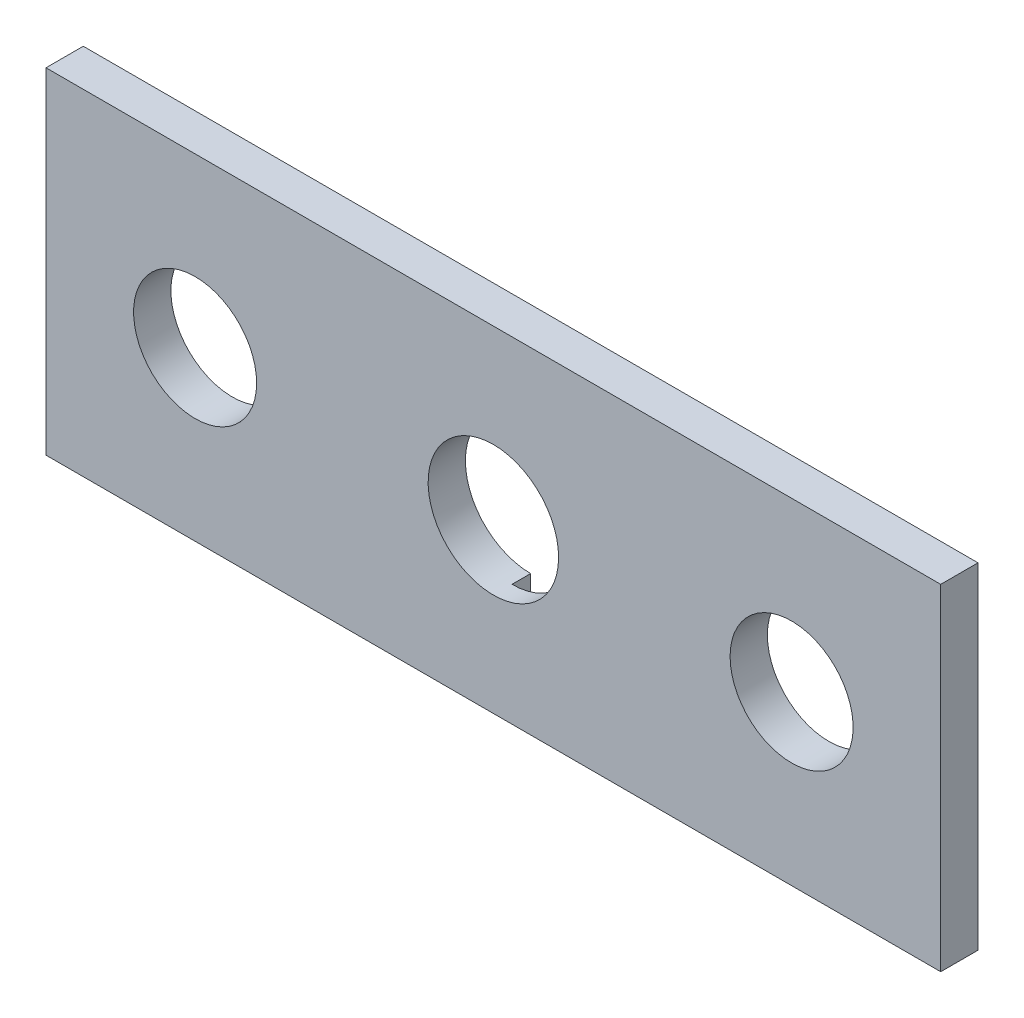
ISO-10303-21;
HEADER;
FILE_DESCRIPTION(('STEP AP214'),'2;1');
FILE_NAME('part.step','',(''),(''),'','','');
FILE_SCHEMA(('AUTOMOTIVE_DESIGN { 1 0 10303 214 1 1 1 1 }'));
ENDSEC;
DATA;
#1=APPLICATION_CONTEXT('core data for automotive mechanical design processes');
#2=APPLICATION_PROTOCOL_DEFINITION('international standard','automotive_design',2000,#1);
#3=PRODUCT_CONTEXT('',#1,'mechanical');
#4=PRODUCT('Part','Part','',(#3));
#5=PRODUCT_RELATED_PRODUCT_CATEGORY('part','',(#4));
#6=PRODUCT_DEFINITION_FORMATION('','',#4);
#7=PRODUCT_DEFINITION_CONTEXT('part definition',#1,'design');
#8=PRODUCT_DEFINITION('design','',#6,#7);
#9=PRODUCT_DEFINITION_SHAPE('','',#8);
#10=(LENGTH_UNIT() NAMED_UNIT(*) SI_UNIT(.MILLI.,.METRE.));
#11=(NAMED_UNIT(*) PLANE_ANGLE_UNIT() SI_UNIT($,.RADIAN.));
#12=(NAMED_UNIT(*) SI_UNIT($,.STERADIAN.) SOLID_ANGLE_UNIT());
#13=UNCERTAINTY_MEASURE_WITH_UNIT(LENGTH_MEASURE(1.E-05),#10,'distance_accuracy_value','');
#14=(GEOMETRIC_REPRESENTATION_CONTEXT(3) GLOBAL_UNCERTAINTY_ASSIGNED_CONTEXT((#13)) GLOBAL_UNIT_ASSIGNED_CONTEXT((#10,
#11,#12)) REPRESENTATION_CONTEXT('',''));
#15=CARTESIAN_POINT('',(0.,0.,0.));
#16=DIRECTION('',(0.,0.,1.));
#17=DIRECTION('',(1.,0.,0.));
#18=AXIS2_PLACEMENT_3D('',#15,#16,#17);
#19=CARTESIAN_POINT('',(0.,0.,10.));
#20=DIRECTION('',(0.,0.,1.));
#21=DIRECTION('',(1.,0.,0.));
#22=AXIS2_PLACEMENT_3D('',#19,#20,#21);
#23=PLANE('',#22);
#24=CARTESIAN_POINT('',(40.,45.,10.));
#25=DIRECTION('',(0.,0.,1.));
#26=DIRECTION('',(1.,0.,0.));
#27=AXIS2_PLACEMENT_3D('',#24,#25,#26);
#28=CIRCLE('',#27,16.5);
#29=CARTESIAN_POINT('',(56.5,45.,10.));
#30=VERTEX_POINT('',#29);
#31=EDGE_CURVE('E164',#30,#30,#28,.T.);
#32=ORIENTED_EDGE('',*,*,#31,.F.);
#33=EDGE_LOOP('',(#32));
#34=FACE_BOUND('',#33,.T.);
#35=DIRECTION('',(0.,-1.,0.));
#36=VECTOR('',#35,1.);
#37=CARTESIAN_POINT('',(0.,90.,10.));
#38=LINE('',#37,#36);
#39=CARTESIAN_POINT('',(0.,90.,10.));
#40=VERTEX_POINT('',#39);
#41=CARTESIAN_POINT('',(0.,0.,10.));
#42=VERTEX_POINT('',#41);
#43=EDGE_CURVE('E174',#40,#42,#38,.T.);
#44=ORIENTED_EDGE('',*,*,#43,.T.);
#45=DIRECTION('',(1.,0.,0.));
#46=VECTOR('',#45,1.);
#47=CARTESIAN_POINT('',(0.,0.,10.));
#48=LINE('',#47,#46);
#49=CARTESIAN_POINT('',(240.,0.,10.));
#50=VERTEX_POINT('',#49);
#51=EDGE_CURVE('E91',#42,#50,#48,.T.);
#52=ORIENTED_EDGE('',*,*,#51,.T.);
#53=DIRECTION('',(0.,1.,0.));
#54=VECTOR('',#53,1.);
#55=CARTESIAN_POINT('',(240.,0.,10.));
#56=LINE('',#55,#54);
#57=CARTESIAN_POINT('',(240.,90.,10.));
#58=VERTEX_POINT('',#57);
#59=EDGE_CURVE('E177',#50,#58,#56,.T.);
#60=ORIENTED_EDGE('',*,*,#59,.T.);
#61=DIRECTION('',(-1.,0.,0.));
#62=VECTOR('',#61,1.);
#63=CARTESIAN_POINT('',(240.,90.,10.));
#64=LINE('',#63,#62);
#65=EDGE_CURVE('E63',#58,#40,#64,.T.);
#66=ORIENTED_EDGE('',*,*,#65,.T.);
#67=EDGE_LOOP('',(#44,#52,#60,#66));
#68=FACE_BOUND('',#67,.T.);
#69=CARTESIAN_POINT('',(120.,45.,10.));
#70=DIRECTION('',(0.,0.,1.));
#71=DIRECTION('',(1.,0.,0.));
#72=AXIS2_PLACEMENT_3D('',#69,#70,#71);
#73=CIRCLE('',#72,17.5);
#74=CARTESIAN_POINT('',(137.5,45.,10.));
#75=VERTEX_POINT('',#74);
#76=EDGE_CURVE('E169',#75,#75,#73,.T.);
#77=ORIENTED_EDGE('',*,*,#76,.F.);
#78=EDGE_LOOP('',(#77));
#79=FACE_BOUND('',#78,.T.);
#80=CARTESIAN_POINT('',(200.,45.,10.));
#81=DIRECTION('',(0.,0.,1.));
#82=DIRECTION('',(-1.,0.,0.));
#83=AXIS2_PLACEMENT_3D('',#80,#81,#82);
#84=CIRCLE('',#83,16.5);
#85=CARTESIAN_POINT('',(183.5,45.,10.));
#86=VERTEX_POINT('',#85);
#87=EDGE_CURVE('E156',#86,#86,#84,.T.);
#88=ORIENTED_EDGE('',*,*,#87,.F.);
#89=EDGE_LOOP('',(#88));
#90=FACE_BOUND('',#89,.T.);
#91=ADVANCED_FACE('F39',(#34,#68,#79,#90),#23,.T.);
#92=CARTESIAN_POINT('',(0.,0.,0.));
#93=DIRECTION('',(0.,0.,1.));
#94=DIRECTION('',(1.,0.,0.));
#95=AXIS2_PLACEMENT_3D('',#92,#93,#94);
#96=PLANE('',#95);
#97=DIRECTION('',(0.,-1.,0.));
#98=VECTOR('',#97,1.);
#99=CARTESIAN_POINT('',(0.,90.,0.));
#100=LINE('',#99,#98);
#101=CARTESIAN_POINT('',(0.,90.,0.));
#102=VERTEX_POINT('',#101);
#103=CARTESIAN_POINT('',(0.,0.,0.));
#104=VERTEX_POINT('',#103);
#105=EDGE_CURVE('E172',#102,#104,#100,.T.);
#106=ORIENTED_EDGE('',*,*,#105,.F.);
#107=DIRECTION('',(-1.,0.,0.));
#108=VECTOR('',#107,1.);
#109=CARTESIAN_POINT('',(240.,90.,0.));
#110=LINE('',#109,#108);
#111=CARTESIAN_POINT('',(240.,90.,0.));
#112=VERTEX_POINT('',#111);
#113=EDGE_CURVE('E84',#112,#102,#110,.T.);
#114=ORIENTED_EDGE('',*,*,#113,.F.);
#115=DIRECTION('',(0.,1.,0.));
#116=VECTOR('',#115,1.);
#117=CARTESIAN_POINT('',(240.,0.,0.));
#118=LINE('',#117,#116);
#119=CARTESIAN_POINT('',(240.,0.,0.));
#120=VERTEX_POINT('',#119);
#121=EDGE_CURVE('E185',#120,#112,#118,.T.);
#122=ORIENTED_EDGE('',*,*,#121,.F.);
#123=DIRECTION('',(1.,0.,0.));
#124=VECTOR('',#123,1.);
#125=CARTESIAN_POINT('',(0.,0.,0.));
#126=LINE('',#125,#124);
#127=EDGE_CURVE('E183',#104,#120,#126,.T.);
#128=ORIENTED_EDGE('',*,*,#127,.F.);
#129=EDGE_LOOP('',(#106,#114,#122,#128));
#130=FACE_BOUND('',#129,.T.);
#131=CARTESIAN_POINT('',(120.,45.,0.));
#132=DIRECTION('',(0.,0.,1.));
#133=DIRECTION('',(1.,0.,0.));
#134=AXIS2_PLACEMENT_3D('',#131,#132,#133);
#135=CIRCLE('',#134,17.5);
#136=CARTESIAN_POINT('',(120.,62.5,0.));
#137=VERTEX_POINT('',#136);
#138=CARTESIAN_POINT('',(120.,27.5,0.));
#139=VERTEX_POINT('',#138);
#140=EDGE_CURVE('E148',#137,#139,#135,.T.);
#141=ORIENTED_EDGE('',*,*,#140,.T.);
#142=DIRECTION('',(0.,1.,0.));
#143=VECTOR('',#142,1.);
#144=CARTESIAN_POINT('',(120.,22.5,0.));
#145=LINE('',#144,#143);
#146=CARTESIAN_POINT('',(120.,22.5,0.));
#147=VERTEX_POINT('',#146);
#148=EDGE_CURVE('E142',#147,#139,#145,.T.);
#149=ORIENTED_EDGE('',*,*,#148,.F.);
#150=DIRECTION('',(-1.,0.,0.));
#151=VECTOR('',#150,1.);
#152=CARTESIAN_POINT('',(165.,22.5,0.));
#153=LINE('',#152,#151);
#154=CARTESIAN_POINT('',(165.,22.5,0.));
#155=VERTEX_POINT('',#154);
#156=EDGE_CURVE('E341',#155,#147,#153,.T.);
#157=ORIENTED_EDGE('',*,*,#156,.F.);
#158=DIRECTION('',(0.,-1.,0.));
#159=VECTOR('',#158,1.);
#160=CARTESIAN_POINT('',(165.,67.5,0.));
#161=LINE('',#160,#159);
#162=CARTESIAN_POINT('',(165.,67.5,0.));
#163=VERTEX_POINT('',#162);
#164=EDGE_CURVE('E351',#163,#155,#161,.T.);
#165=ORIENTED_EDGE('',*,*,#164,.F.);
#166=DIRECTION('',(1.,0.,0.));
#167=VECTOR('',#166,1.);
#168=CARTESIAN_POINT('',(120.,67.5,0.));
#169=LINE('',#168,#167);
#170=CARTESIAN_POINT('',(120.,67.5,0.));
#171=VERTEX_POINT('',#170);
#172=EDGE_CURVE('E349',#171,#163,#169,.T.);
#173=ORIENTED_EDGE('',*,*,#172,.F.);
#174=DIRECTION('',(0.,1.,0.));
#175=VECTOR('',#174,1.);
#176=CARTESIAN_POINT('',(120.,62.5,0.));
#177=LINE('',#176,#175);
#178=EDGE_CURVE('E346',#137,#171,#177,.T.);
#179=ORIENTED_EDGE('',*,*,#178,.F.);
#180=EDGE_LOOP('',(#141,#149,#157,#165,#173,#179));
#181=FACE_BOUND('',#180,.T.);
#182=CARTESIAN_POINT('',(40.,45.,0.));
#183=DIRECTION('',(0.,0.,1.));
#184=DIRECTION('',(1.,0.,0.));
#185=AXIS2_PLACEMENT_3D('',#182,#183,#184);
#186=CIRCLE('',#185,16.5);
#187=CARTESIAN_POINT('',(56.5,45.,0.));
#188=VERTEX_POINT('',#187);
#189=EDGE_CURVE('E159',#188,#188,#186,.T.);
#190=ORIENTED_EDGE('',*,*,#189,.T.);
#191=EDGE_LOOP('',(#190));
#192=FACE_BOUND('',#191,.T.);
#193=CARTESIAN_POINT('',(200.,45.,0.));
#194=DIRECTION('',(0.,0.,1.));
#195=DIRECTION('',(-1.,0.,0.));
#196=AXIS2_PLACEMENT_3D('',#193,#194,#195);
#197=CIRCLE('',#196,16.5);
#198=CARTESIAN_POINT('',(183.5,45.,0.));
#199=VERTEX_POINT('',#198);
#200=EDGE_CURVE('E160',#199,#199,#197,.T.);
#201=ORIENTED_EDGE('',*,*,#200,.T.);
#202=EDGE_LOOP('',(#201));
#203=FACE_BOUND('',#202,.T.);
#204=ADVANCED_FACE('F198',(#130,#181,#192,#203),#96,.F.);
#205=CARTESIAN_POINT('',(0.,90.,10.));
#206=DIRECTION('',(1.,0.,0.));
#207=DIRECTION('',(0.,0.,-1.));
#208=AXIS2_PLACEMENT_3D('',#205,#206,#207);
#209=PLANE('',#208);
#210=ORIENTED_EDGE('',*,*,#105,.T.);
#211=DIRECTION('',(0.,0.,-1.));
#212=VECTOR('',#211,1.);
#213=CARTESIAN_POINT('',(0.,0.,10.));
#214=LINE('',#213,#212);
#215=EDGE_CURVE('E11',#42,#104,#214,.T.);
#216=ORIENTED_EDGE('',*,*,#215,.F.);
#217=ORIENTED_EDGE('',*,*,#43,.F.);
#218=DIRECTION('',(0.,0.,-1.));
#219=VECTOR('',#218,1.);
#220=CARTESIAN_POINT('',(0.,90.,10.));
#221=LINE('',#220,#219);
#222=EDGE_CURVE('E180',#40,#102,#221,.T.);
#223=ORIENTED_EDGE('',*,*,#222,.T.);
#224=EDGE_LOOP('',(#210,#216,#217,#223));
#225=FACE_BOUND('',#224,.T.);
#226=ADVANCED_FACE('F41',(#225),#209,.F.);
#227=CARTESIAN_POINT('',(0.,0.,10.));
#228=DIRECTION('',(0.,1.,0.));
#229=DIRECTION('',(0.,0.,1.));
#230=AXIS2_PLACEMENT_3D('',#227,#228,#229);
#231=PLANE('',#230);
#232=ORIENTED_EDGE('',*,*,#127,.T.);
#233=DIRECTION('',(0.,0.,-1.));
#234=VECTOR('',#233,1.);
#235=CARTESIAN_POINT('',(240.,0.,10.));
#236=LINE('',#235,#234);
#237=EDGE_CURVE('E47',#50,#120,#236,.T.);
#238=ORIENTED_EDGE('',*,*,#237,.F.);
#239=ORIENTED_EDGE('',*,*,#51,.F.);
#240=ORIENTED_EDGE('',*,*,#215,.T.);
#241=EDGE_LOOP('',(#232,#238,#239,#240));
#242=FACE_BOUND('',#241,.T.);
#243=ADVANCED_FACE('F213',(#242),#231,.F.);
#244=CARTESIAN_POINT('',(240.,0.,10.));
#245=DIRECTION('',(-1.,0.,0.));
#246=DIRECTION('',(0.,0.,1.));
#247=AXIS2_PLACEMENT_3D('',#244,#245,#246);
#248=PLANE('',#247);
#249=ORIENTED_EDGE('',*,*,#121,.T.);
#250=DIRECTION('',(0.,0.,-1.));
#251=VECTOR('',#250,1.);
#252=CARTESIAN_POINT('',(240.,90.,10.));
#253=LINE('',#252,#251);
#254=EDGE_CURVE('E189',#58,#112,#253,.T.);
#255=ORIENTED_EDGE('',*,*,#254,.F.);
#256=ORIENTED_EDGE('',*,*,#59,.F.);
#257=ORIENTED_EDGE('',*,*,#237,.T.);
#258=EDGE_LOOP('',(#249,#255,#256,#257));
#259=FACE_BOUND('',#258,.T.);
#260=ADVANCED_FACE('F194',(#259),#248,.F.);
#261=CARTESIAN_POINT('',(240.,90.,10.));
#262=DIRECTION('',(0.,-1.,0.));
#263=DIRECTION('',(1.,0.,0.));
#264=AXIS2_PLACEMENT_3D('',#261,#262,#263);
#265=PLANE('',#264);
#266=ORIENTED_EDGE('',*,*,#113,.T.);
#267=ORIENTED_EDGE('',*,*,#222,.F.);
#268=ORIENTED_EDGE('',*,*,#65,.F.);
#269=ORIENTED_EDGE('',*,*,#254,.T.);
#270=EDGE_LOOP('',(#266,#267,#268,#269));
#271=FACE_BOUND('',#270,.T.);
#272=ADVANCED_FACE('F203',(#271),#265,.F.);
#273=CARTESIAN_POINT('',(120.,45.,10.));
#274=DIRECTION('',(0.,0.,-1.));
#275=DIRECTION('',(-1.,0.,0.));
#276=AXIS2_PLACEMENT_3D('',#273,#274,#275);
#277=CYLINDRICAL_SURFACE('',#276,17.5);
#278=DIRECTION('',(0.,0.,-1.));
#279=VECTOR('',#278,1.);
#280=CARTESIAN_POINT('',(120.,27.5,5.));
#281=LINE('',#280,#279);
#282=CARTESIAN_POINT('',(120.,27.5,5.));
#283=VERTEX_POINT('',#282);
#284=EDGE_CURVE('E163',#283,#139,#281,.T.);
#285=ORIENTED_EDGE('',*,*,#284,.T.);
#286=ORIENTED_EDGE('',*,*,#140,.F.);
#287=DIRECTION('',(0.,0.,-1.));
#288=VECTOR('',#287,1.);
#289=CARTESIAN_POINT('',(120.,62.5,5.));
#290=LINE('',#289,#288);
#291=CARTESIAN_POINT('',(120.,62.5,5.));
#292=VERTEX_POINT('',#291);
#293=EDGE_CURVE('E130',#292,#137,#290,.T.);
#294=ORIENTED_EDGE('',*,*,#293,.F.);
#295=CARTESIAN_POINT('',(120.,45.,5.));
#296=DIRECTION('',(0.,0.,1.));
#297=DIRECTION('',(-1.,0.,0.));
#298=AXIS2_PLACEMENT_3D('',#295,#296,#297);
#299=CIRCLE('',#298,17.5);
#300=EDGE_CURVE('E136',#283,#292,#299,.T.);
#301=ORIENTED_EDGE('',*,*,#300,.F.);
#302=EDGE_LOOP('',(#285,#286,#294,#301));
#303=FACE_BOUND('',#302,.T.);
#304=ORIENTED_EDGE('',*,*,#76,.T.);
#305=EDGE_LOOP('',(#304));
#306=FACE_BOUND('',#305,.T.);
#307=ADVANCED_FACE('F145',(#303,#306),#277,.F.);
#308=CARTESIAN_POINT('',(40.,45.,10.));
#309=DIRECTION('',(0.,0.,-1.));
#310=DIRECTION('',(-1.,0.,0.));
#311=AXIS2_PLACEMENT_3D('',#308,#309,#310);
#312=CYLINDRICAL_SURFACE('',#311,16.5);
#313=ORIENTED_EDGE('',*,*,#31,.T.);
#314=EDGE_LOOP('',(#313));
#315=FACE_BOUND('',#314,.T.);
#316=ORIENTED_EDGE('',*,*,#189,.F.);
#317=EDGE_LOOP('',(#316));
#318=FACE_BOUND('',#317,.T.);
#319=ADVANCED_FACE('F211',(#315,#318),#312,.F.);
#320=CARTESIAN_POINT('',(200.,45.,10.));
#321=DIRECTION('',(0.,0.,-1.));
#322=DIRECTION('',(-1.,0.,0.));
#323=AXIS2_PLACEMENT_3D('',#320,#321,#322);
#324=CYLINDRICAL_SURFACE('',#323,16.5);
#325=ORIENTED_EDGE('',*,*,#87,.T.);
#326=EDGE_LOOP('',(#325));
#327=FACE_BOUND('',#326,.T.);
#328=ORIENTED_EDGE('',*,*,#200,.F.);
#329=EDGE_LOOP('',(#328));
#330=FACE_BOUND('',#329,.T.);
#331=ADVANCED_FACE('F226',(#327,#330),#324,.F.);
#332=CARTESIAN_POINT('',(120.,22.5,5.));
#333=DIRECTION('',(-1.,0.,0.));
#334=DIRECTION('',(0.,0.,1.));
#335=AXIS2_PLACEMENT_3D('',#332,#333,#334);
#336=PLANE('',#335);
#337=ORIENTED_EDGE('',*,*,#148,.T.);
#338=ORIENTED_EDGE('',*,*,#284,.F.);
#339=DIRECTION('',(0.,1.,0.));
#340=VECTOR('',#339,1.);
#341=CARTESIAN_POINT('',(120.,22.5,5.));
#342=LINE('',#341,#340);
#343=CARTESIAN_POINT('',(120.,22.5,5.));
#344=VERTEX_POINT('',#343);
#345=EDGE_CURVE('E54',#344,#283,#342,.T.);
#346=ORIENTED_EDGE('',*,*,#345,.F.);
#347=DIRECTION('',(0.,0.,-1.));
#348=VECTOR('',#347,1.);
#349=CARTESIAN_POINT('',(120.,22.5,5.));
#350=LINE('',#349,#348);
#351=EDGE_CURVE('E338',#344,#147,#350,.T.);
#352=ORIENTED_EDGE('',*,*,#351,.T.);
#353=EDGE_LOOP('',(#337,#338,#346,#352));
#354=FACE_BOUND('',#353,.T.);
#355=ADVANCED_FACE('F230',(#354),#336,.F.);
#356=CARTESIAN_POINT('',(165.,22.5,5.));
#357=DIRECTION('',(0.,-1.,0.));
#358=DIRECTION('',(0.,0.,-1.));
#359=AXIS2_PLACEMENT_3D('',#356,#357,#358);
#360=PLANE('',#359);
#361=ORIENTED_EDGE('',*,*,#156,.T.);
#362=ORIENTED_EDGE('',*,*,#351,.F.);
#363=DIRECTION('',(-1.,0.,0.));
#364=VECTOR('',#363,1.);
#365=CARTESIAN_POINT('',(165.,22.5,5.));
#366=LINE('',#365,#364);
#367=CARTESIAN_POINT('',(165.,22.5,5.));
#368=VERTEX_POINT('',#367);
#369=EDGE_CURVE('E152',#368,#344,#366,.T.);
#370=ORIENTED_EDGE('',*,*,#369,.F.);
#371=DIRECTION('',(0.,0.,-1.));
#372=VECTOR('',#371,1.);
#373=CARTESIAN_POINT('',(165.,22.5,5.));
#374=LINE('',#373,#372);
#375=EDGE_CURVE('E359',#368,#155,#374,.T.);
#376=ORIENTED_EDGE('',*,*,#375,.T.);
#377=EDGE_LOOP('',(#361,#362,#370,#376));
#378=FACE_BOUND('',#377,.T.);
#379=ADVANCED_FACE('F241',(#378),#360,.F.);
#380=CARTESIAN_POINT('',(165.,67.5,5.));
#381=DIRECTION('',(1.,0.,0.));
#382=DIRECTION('',(0.,0.,-1.));
#383=AXIS2_PLACEMENT_3D('',#380,#381,#382);
#384=PLANE('',#383);
#385=ORIENTED_EDGE('',*,*,#164,.T.);
#386=ORIENTED_EDGE('',*,*,#375,.F.);
#387=DIRECTION('',(0.,-1.,0.));
#388=VECTOR('',#387,1.);
#389=CARTESIAN_POINT('',(165.,67.5,5.));
#390=LINE('',#389,#388);
#391=CARTESIAN_POINT('',(165.,67.5,5.));
#392=VERTEX_POINT('',#391);
#393=EDGE_CURVE('E362',#392,#368,#390,.T.);
#394=ORIENTED_EDGE('',*,*,#393,.F.);
#395=DIRECTION('',(0.,0.,-1.));
#396=VECTOR('',#395,1.);
#397=CARTESIAN_POINT('',(165.,67.5,5.));
#398=LINE('',#397,#396);
#399=EDGE_CURVE('E150',#392,#163,#398,.T.);
#400=ORIENTED_EDGE('',*,*,#399,.T.);
#401=EDGE_LOOP('',(#385,#386,#394,#400));
#402=FACE_BOUND('',#401,.T.);
#403=ADVANCED_FACE('F237',(#402),#384,.F.);
#404=CARTESIAN_POINT('',(120.,67.5,5.));
#405=DIRECTION('',(0.,1.,0.));
#406=DIRECTION('',(0.,0.,1.));
#407=AXIS2_PLACEMENT_3D('',#404,#405,#406);
#408=PLANE('',#407);
#409=ORIENTED_EDGE('',*,*,#172,.T.);
#410=ORIENTED_EDGE('',*,*,#399,.F.);
#411=DIRECTION('',(1.,0.,0.));
#412=VECTOR('',#411,1.);
#413=CARTESIAN_POINT('',(120.,67.5,5.));
#414=LINE('',#413,#412);
#415=CARTESIAN_POINT('',(120.,67.5,5.));
#416=VERTEX_POINT('',#415);
#417=EDGE_CURVE('E135',#416,#392,#414,.T.);
#418=ORIENTED_EDGE('',*,*,#417,.F.);
#419=DIRECTION('',(0.,0.,-1.));
#420=VECTOR('',#419,1.);
#421=CARTESIAN_POINT('',(120.,67.5,5.));
#422=LINE('',#421,#420);
#423=EDGE_CURVE('E132',#416,#171,#422,.T.);
#424=ORIENTED_EDGE('',*,*,#423,.T.);
#425=EDGE_LOOP('',(#409,#410,#418,#424));
#426=FACE_BOUND('',#425,.T.);
#427=ADVANCED_FACE('F234',(#426),#408,.F.);
#428=CARTESIAN_POINT('',(120.,62.5,5.));
#429=DIRECTION('',(-1.,0.,0.));
#430=DIRECTION('',(0.,0.,1.));
#431=AXIS2_PLACEMENT_3D('',#428,#429,#430);
#432=PLANE('',#431);
#433=ORIENTED_EDGE('',*,*,#178,.T.);
#434=ORIENTED_EDGE('',*,*,#423,.F.);
#435=DIRECTION('',(0.,1.,0.));
#436=VECTOR('',#435,1.);
#437=CARTESIAN_POINT('',(120.,62.5,5.));
#438=LINE('',#437,#436);
#439=EDGE_CURVE('E126',#292,#416,#438,.T.);
#440=ORIENTED_EDGE('',*,*,#439,.F.);
#441=ORIENTED_EDGE('',*,*,#293,.T.);
#442=EDGE_LOOP('',(#433,#434,#440,#441));
#443=FACE_BOUND('',#442,.T.);
#444=ADVANCED_FACE('F128',(#443),#432,.F.);
#445=CARTESIAN_POINT('',(120.,45.,5.));
#446=DIRECTION('',(0.,0.,-1.));
#447=DIRECTION('',(-1.,0.,0.));
#448=AXIS2_PLACEMENT_3D('',#445,#446,#447);
#449=PLANE('',#448);
#450=ORIENTED_EDGE('',*,*,#300,.T.);
#451=ORIENTED_EDGE('',*,*,#439,.T.);
#452=ORIENTED_EDGE('',*,*,#417,.T.);
#453=ORIENTED_EDGE('',*,*,#393,.T.);
#454=ORIENTED_EDGE('',*,*,#369,.T.);
#455=ORIENTED_EDGE('',*,*,#345,.T.);
#456=EDGE_LOOP('',(#450,#451,#452,#453,#454,#455));
#457=FACE_BOUND('',#456,.T.);
#458=ADVANCED_FACE('F139',(#457),#449,.T.);
#459=CLOSED_SHELL('',(#91,#204,#226,#243,#260,#272,#307,#319,#331,#355,#379,#403,#427,#444,#458));
#460=MANIFOLD_SOLID_BREP('B2',#459);
#461=ADVANCED_BREP_SHAPE_REPRESENTATION('',(#18,#460),#14);
#462=SHAPE_DEFINITION_REPRESENTATION(#9,#461);
ENDSEC;
END-ISO-10303-21;
